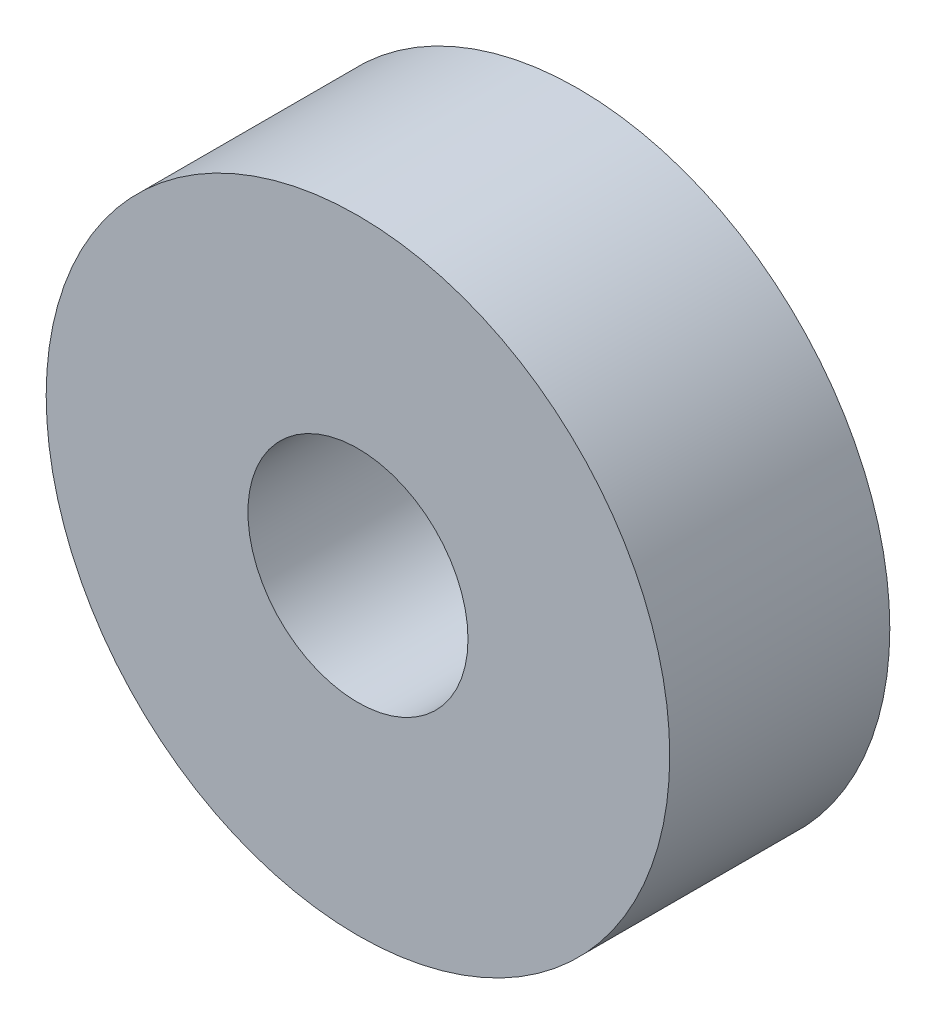
ISO-10303-21;
HEADER;
FILE_DESCRIPTION(('STEP AP214'),'2;1');
FILE_NAME('part.step','',(''),(''),'','','');
FILE_SCHEMA(('AUTOMOTIVE_DESIGN { 1 0 10303 214 1 1 1 1 }'));
ENDSEC;
DATA;
#1=APPLICATION_CONTEXT('core data for automotive mechanical design processes');
#2=APPLICATION_PROTOCOL_DEFINITION('international standard','automotive_design',2000,#1);
#3=PRODUCT_CONTEXT('',#1,'mechanical');
#4=PRODUCT('Part','Part','',(#3));
#5=PRODUCT_RELATED_PRODUCT_CATEGORY('part','',(#4));
#6=PRODUCT_DEFINITION_FORMATION('','',#4);
#7=PRODUCT_DEFINITION_CONTEXT('part definition',#1,'design');
#8=PRODUCT_DEFINITION('design','',#6,#7);
#9=PRODUCT_DEFINITION_SHAPE('','',#8);
#10=(LENGTH_UNIT() NAMED_UNIT(*) SI_UNIT(.MILLI.,.METRE.));
#11=(NAMED_UNIT(*) PLANE_ANGLE_UNIT() SI_UNIT($,.RADIAN.));
#12=(NAMED_UNIT(*) SI_UNIT($,.STERADIAN.) SOLID_ANGLE_UNIT());
#13=UNCERTAINTY_MEASURE_WITH_UNIT(LENGTH_MEASURE(1.E-05),#10,'distance_accuracy_value','');
#14=(GEOMETRIC_REPRESENTATION_CONTEXT(3) GLOBAL_UNCERTAINTY_ASSIGNED_CONTEXT((#13)) GLOBAL_UNIT_ASSIGNED_CONTEXT((#10,
#11,#12)) REPRESENTATION_CONTEXT('',''));
#15=CARTESIAN_POINT('',(0.,0.,0.));
#16=DIRECTION('',(0.,0.,1.));
#17=DIRECTION('',(1.,0.,0.));
#18=AXIS2_PLACEMENT_3D('',#15,#16,#17);
#19=CARTESIAN_POINT('',(0.,0.,6.));
#20=DIRECTION('',(0.,0.,1.));
#21=DIRECTION('',(1.,0.,0.));
#22=AXIS2_PLACEMENT_3D('',#19,#20,#21);
#23=PLANE('',#22);
#24=CARTESIAN_POINT('',(0.,0.,6.));
#25=DIRECTION('',(0.,0.,1.));
#26=DIRECTION('',(1.,0.,0.));
#27=AXIS2_PLACEMENT_3D('',#24,#25,#26);
#28=CIRCLE('',#27,8.5);
#29=CARTESIAN_POINT('',(8.5,0.,6.));
#30=VERTEX_POINT('',#29);
#31=EDGE_CURVE('E10',#30,#30,#28,.T.);
#32=ORIENTED_EDGE('',*,*,#31,.T.);
#33=EDGE_LOOP('',(#32));
#34=FACE_BOUND('',#33,.T.);
#35=CARTESIAN_POINT('',(0.,0.,6.));
#36=DIRECTION('',(0.,0.,1.));
#37=DIRECTION('',(1.,0.,0.));
#38=AXIS2_PLACEMENT_3D('',#35,#36,#37);
#39=CIRCLE('',#38,3.);
#40=CARTESIAN_POINT('',(3.,0.,6.));
#41=VERTEX_POINT('',#40);
#42=EDGE_CURVE('E56',#41,#41,#39,.T.);
#43=ORIENTED_EDGE('',*,*,#42,.F.);
#44=EDGE_LOOP('',(#43));
#45=FACE_BOUND('',#44,.T.);
#46=ADVANCED_FACE('F43',(#34,#45),#23,.T.);
#47=CARTESIAN_POINT('',(0.,0.,0.));
#48=DIRECTION('',(0.,0.,1.));
#49=DIRECTION('',(1.,0.,0.));
#50=AXIS2_PLACEMENT_3D('',#47,#48,#49);
#51=PLANE('',#50);
#52=CARTESIAN_POINT('',(0.,0.,0.));
#53=DIRECTION('',(0.,0.,1.));
#54=DIRECTION('',(1.,0.,0.));
#55=AXIS2_PLACEMENT_3D('',#52,#53,#54);
#56=CIRCLE('',#55,8.5);
#57=CARTESIAN_POINT('',(8.5,0.,0.));
#58=VERTEX_POINT('',#57);
#59=EDGE_CURVE('E47',#58,#58,#56,.T.);
#60=ORIENTED_EDGE('',*,*,#59,.F.);
#61=EDGE_LOOP('',(#60));
#62=FACE_BOUND('',#61,.T.);
#63=CARTESIAN_POINT('',(0.,0.,0.));
#64=DIRECTION('',(0.,0.,1.));
#65=DIRECTION('',(1.,0.,0.));
#66=AXIS2_PLACEMENT_3D('',#63,#64,#65);
#67=CIRCLE('',#66,3.);
#68=CARTESIAN_POINT('',(3.,0.,0.));
#69=VERTEX_POINT('',#68);
#70=EDGE_CURVE('E58',#69,#69,#67,.T.);
#71=ORIENTED_EDGE('',*,*,#70,.T.);
#72=EDGE_LOOP('',(#71));
#73=FACE_BOUND('',#72,.T.);
#74=ADVANCED_FACE('F70',(#62,#73),#51,.F.);
#75=CARTESIAN_POINT('',(0.,0.,6.));
#76=DIRECTION('',(0.,0.,-1.));
#77=DIRECTION('',(-1.,0.,0.));
#78=AXIS2_PLACEMENT_3D('',#75,#76,#77);
#79=CYLINDRICAL_SURFACE('',#78,8.5);
#80=ORIENTED_EDGE('',*,*,#31,.F.);
#81=EDGE_LOOP('',(#80));
#82=FACE_BOUND('',#81,.T.);
#83=ORIENTED_EDGE('',*,*,#59,.T.);
#84=EDGE_LOOP('',(#83));
#85=FACE_BOUND('',#84,.T.);
#86=ADVANCED_FACE('F45',(#82,#85),#79,.T.);
#87=CARTESIAN_POINT('',(0.,0.,6.));
#88=DIRECTION('',(0.,0.,-1.));
#89=DIRECTION('',(-1.,0.,0.));
#90=AXIS2_PLACEMENT_3D('',#87,#88,#89);
#91=CYLINDRICAL_SURFACE('',#90,3.);
#92=ORIENTED_EDGE('',*,*,#42,.T.);
#93=EDGE_LOOP('',(#92));
#94=FACE_BOUND('',#93,.T.);
#95=ORIENTED_EDGE('',*,*,#70,.F.);
#96=EDGE_LOOP('',(#95));
#97=FACE_BOUND('',#96,.T.);
#98=ADVANCED_FACE('F66',(#94,#97),#91,.F.);
#99=CLOSED_SHELL('',(#46,#74,#86,#98));
#100=MANIFOLD_SOLID_BREP('B2',#99);
#101=ADVANCED_BREP_SHAPE_REPRESENTATION('',(#18,#100),#14);
#102=SHAPE_DEFINITION_REPRESENTATION(#9,#101);
ENDSEC;
END-ISO-10303-21;
